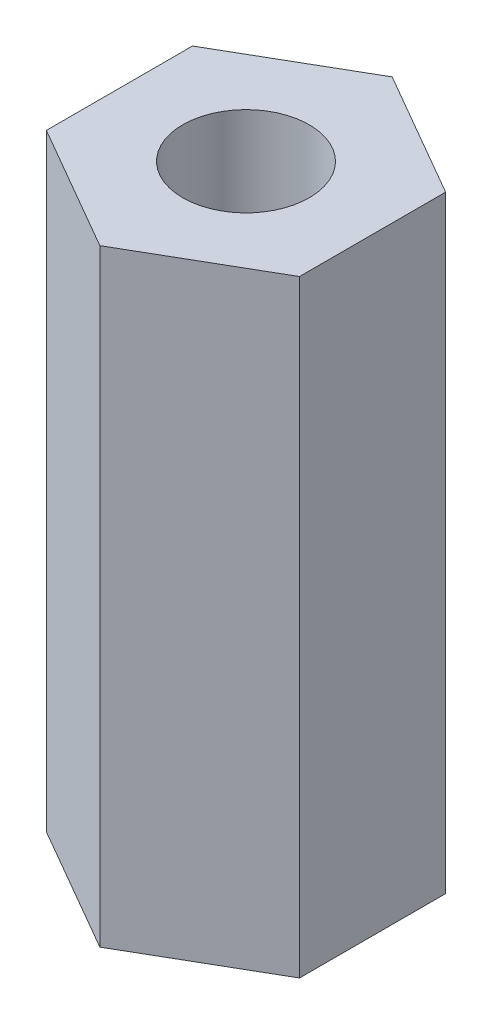
ISO-10303-21;
HEADER;
FILE_DESCRIPTION(('STEP AP214'),'2;1');
FILE_NAME('part.step','',(''),(''),'','','');
FILE_SCHEMA(('AUTOMOTIVE_DESIGN { 1 0 10303 214 1 1 1 1 }'));
ENDSEC;
DATA;
#1=APPLICATION_CONTEXT('core data for automotive mechanical design processes');
#2=APPLICATION_PROTOCOL_DEFINITION('international standard','automotive_design',2000,#1);
#3=PRODUCT_CONTEXT('',#1,'mechanical');
#4=PRODUCT('Part','Part','',(#3));
#5=PRODUCT_RELATED_PRODUCT_CATEGORY('part','',(#4));
#6=PRODUCT_DEFINITION_FORMATION('','',#4);
#7=PRODUCT_DEFINITION_CONTEXT('part definition',#1,'design');
#8=PRODUCT_DEFINITION('design','',#6,#7);
#9=PRODUCT_DEFINITION_SHAPE('','',#8);
#10=(LENGTH_UNIT() NAMED_UNIT(*) SI_UNIT(.MILLI.,.METRE.));
#11=(NAMED_UNIT(*) PLANE_ANGLE_UNIT() SI_UNIT($,.RADIAN.));
#12=(NAMED_UNIT(*) SI_UNIT($,.STERADIAN.) SOLID_ANGLE_UNIT());
#13=UNCERTAINTY_MEASURE_WITH_UNIT(LENGTH_MEASURE(1.E-05),#10,'distance_accuracy_value','');
#14=(GEOMETRIC_REPRESENTATION_CONTEXT(3) GLOBAL_UNCERTAINTY_ASSIGNED_CONTEXT((#13)) GLOBAL_UNIT_ASSIGNED_CONTEXT((#10,
#11,#12)) REPRESENTATION_CONTEXT('',''));
#15=CARTESIAN_POINT('',(0.,0.,0.));
#16=DIRECTION('',(0.,0.,1.));
#17=DIRECTION('',(1.,0.,0.));
#18=AXIS2_PLACEMENT_3D('',#15,#16,#17);
#19=CARTESIAN_POINT('',(-6.35,30.48,3.66617420935412));
#20=DIRECTION('',(0.5,0.,-0.866025403784439));
#21=DIRECTION('',(-0.866025403784439,0.,-0.5));
#22=AXIS2_PLACEMENT_3D('',#19,#20,#21);
#23=PLANE('',#22);
#24=DIRECTION('',(0.866025403784439,0.,0.5));
#25=VECTOR('',#24,1.);
#26=CARTESIAN_POINT('',(-6.35,0.,3.66617420935412));
#27=LINE('',#26,#25);
#28=CARTESIAN_POINT('',(-6.35,0.,3.66617420935412));
#29=VERTEX_POINT('',#28);
#30=CARTESIAN_POINT('',(0.,0.,7.33234841870824));
#31=VERTEX_POINT('',#30);
#32=EDGE_CURVE('E132',#29,#31,#27,.T.);
#33=ORIENTED_EDGE('',*,*,#32,.T.);
#34=DIRECTION('',(0.,-1.,0.));
#35=VECTOR('',#34,1.);
#36=CARTESIAN_POINT('',(0.,30.48,7.33234841870824));
#37=LINE('',#36,#35);
#38=CARTESIAN_POINT('',(0.,30.48,7.33234841870824));
#39=VERTEX_POINT('',#38);
#40=EDGE_CURVE('E11',#39,#31,#37,.T.);
#41=ORIENTED_EDGE('',*,*,#40,.F.);
#42=DIRECTION('',(0.866025403784439,0.,0.5));
#43=VECTOR('',#42,1.);
#44=CARTESIAN_POINT('',(-6.35,30.48,3.66617420935412));
#45=LINE('',#44,#43);
#46=CARTESIAN_POINT('',(-6.35,30.48,3.66617420935412));
#47=VERTEX_POINT('',#46);
#48=EDGE_CURVE('E149',#47,#39,#45,.T.);
#49=ORIENTED_EDGE('',*,*,#48,.F.);
#50=DIRECTION('',(0.,-1.,0.));
#51=VECTOR('',#50,1.);
#52=CARTESIAN_POINT('',(-6.35,30.48,3.66617420935412));
#53=LINE('',#52,#51);
#54=EDGE_CURVE('E128',#47,#29,#53,.T.);
#55=ORIENTED_EDGE('',*,*,#54,.T.);
#56=EDGE_LOOP('',(#33,#41,#49,#55));
#57=FACE_BOUND('',#56,.T.);
#58=ADVANCED_FACE('F43',(#57),#23,.F.);
#59=CARTESIAN_POINT('',(0.,30.48,7.33234841870824));
#60=DIRECTION('',(-0.5,0.,-0.866025403784439));
#61=DIRECTION('',(-0.866025403784439,0.,0.5));
#62=AXIS2_PLACEMENT_3D('',#59,#60,#61);
#63=PLANE('',#62);
#64=DIRECTION('',(0.866025403784439,0.,-0.5));
#65=VECTOR('',#64,1.);
#66=CARTESIAN_POINT('',(0.,0.,7.33234841870824));
#67=LINE('',#66,#65);
#68=CARTESIAN_POINT('',(6.35,0.,3.66617420935412));
#69=VERTEX_POINT('',#68);
#70=EDGE_CURVE('E136',#31,#69,#67,.T.);
#71=ORIENTED_EDGE('',*,*,#70,.T.);
#72=DIRECTION('',(0.,-1.,0.));
#73=VECTOR('',#72,1.);
#74=CARTESIAN_POINT('',(6.35,30.48,3.66617420935412));
#75=LINE('',#74,#73);
#76=CARTESIAN_POINT('',(6.35,30.48,3.66617420935412));
#77=VERTEX_POINT('',#76);
#78=EDGE_CURVE('E52',#77,#69,#75,.T.);
#79=ORIENTED_EDGE('',*,*,#78,.F.);
#80=DIRECTION('',(0.866025403784439,0.,-0.5));
#81=VECTOR('',#80,1.);
#82=CARTESIAN_POINT('',(0.,30.48,7.33234841870824));
#83=LINE('',#82,#81);
#84=EDGE_CURVE('E97',#39,#77,#83,.T.);
#85=ORIENTED_EDGE('',*,*,#84,.F.);
#86=ORIENTED_EDGE('',*,*,#40,.T.);
#87=EDGE_LOOP('',(#71,#79,#85,#86));
#88=FACE_BOUND('',#87,.T.);
#89=ADVANCED_FACE('F178',(#88),#63,.F.);
#90=CARTESIAN_POINT('',(6.35,30.48,3.66617420935412));
#91=DIRECTION('',(-1.,0.,0.));
#92=DIRECTION('',(0.,0.,1.));
#93=AXIS2_PLACEMENT_3D('',#90,#91,#92);
#94=PLANE('',#93);
#95=DIRECTION('',(0.,0.,-1.));
#96=VECTOR('',#95,1.);
#97=CARTESIAN_POINT('',(6.35,0.,3.66617420935412));
#98=LINE('',#97,#96);
#99=CARTESIAN_POINT('',(6.35,0.,-3.66617420935413));
#100=VERTEX_POINT('',#99);
#101=EDGE_CURVE('E140',#69,#100,#98,.T.);
#102=ORIENTED_EDGE('',*,*,#101,.T.);
#103=DIRECTION('',(0.,-1.,0.));
#104=VECTOR('',#103,1.);
#105=CARTESIAN_POINT('',(6.35,30.48,-3.66617420935413));
#106=LINE('',#105,#104);
#107=CARTESIAN_POINT('',(6.35,30.48,-3.66617420935413));
#108=VERTEX_POINT('',#107);
#109=EDGE_CURVE('E121',#108,#100,#106,.T.);
#110=ORIENTED_EDGE('',*,*,#109,.F.);
#111=DIRECTION('',(0.,0.,-1.));
#112=VECTOR('',#111,1.);
#113=CARTESIAN_POINT('',(6.35,30.48,3.66617420935412));
#114=LINE('',#113,#112);
#115=EDGE_CURVE('E110',#77,#108,#114,.T.);
#116=ORIENTED_EDGE('',*,*,#115,.F.);
#117=ORIENTED_EDGE('',*,*,#78,.T.);
#118=EDGE_LOOP('',(#102,#110,#116,#117));
#119=FACE_BOUND('',#118,.T.);
#120=ADVANCED_FACE('F159',(#119),#94,.F.);
#121=CARTESIAN_POINT('',(6.35,30.48,-3.66617420935413));
#122=DIRECTION('',(-0.5,0.,0.866025403784439));
#123=DIRECTION('',(0.866025403784439,0.,0.5));
#124=AXIS2_PLACEMENT_3D('',#121,#122,#123);
#125=PLANE('',#124);
#126=DIRECTION('',(-0.866025403784439,0.,-0.5));
#127=VECTOR('',#126,1.);
#128=CARTESIAN_POINT('',(6.35,0.,-3.66617420935413));
#129=LINE('',#128,#127);
#130=CARTESIAN_POINT('',(0.,0.,-7.33234841870825));
#131=VERTEX_POINT('',#130);
#132=EDGE_CURVE('E119',#100,#131,#129,.T.);
#133=ORIENTED_EDGE('',*,*,#132,.T.);
#134=DIRECTION('',(0.,-1.,0.));
#135=VECTOR('',#134,1.);
#136=CARTESIAN_POINT('',(0.,30.48,-7.33234841870825));
#137=LINE('',#136,#135);
#138=CARTESIAN_POINT('',(0.,30.48,-7.33234841870825));
#139=VERTEX_POINT('',#138);
#140=EDGE_CURVE('E116',#139,#131,#137,.T.);
#141=ORIENTED_EDGE('',*,*,#140,.F.);
#142=DIRECTION('',(-0.866025403784439,0.,-0.5));
#143=VECTOR('',#142,1.);
#144=CARTESIAN_POINT('',(6.35,30.48,-3.66617420935413));
#145=LINE('',#144,#143);
#146=EDGE_CURVE('E104',#108,#139,#145,.T.);
#147=ORIENTED_EDGE('',*,*,#146,.F.);
#148=ORIENTED_EDGE('',*,*,#109,.T.);
#149=EDGE_LOOP('',(#133,#141,#147,#148));
#150=FACE_BOUND('',#149,.T.);
#151=ADVANCED_FACE('F117',(#150),#125,.F.);
#152=CARTESIAN_POINT('',(0.,30.48,-7.33234841870825));
#153=DIRECTION('',(0.5,0.,0.866025403784439));
#154=DIRECTION('',(0.866025403784439,0.,-0.5));
#155=AXIS2_PLACEMENT_3D('',#152,#153,#154);
#156=PLANE('',#155);
#157=DIRECTION('',(-0.866025403784439,0.,0.5));
#158=VECTOR('',#157,1.);
#159=CARTESIAN_POINT('',(0.,0.,-7.33234841870825));
#160=LINE('',#159,#158);
#161=CARTESIAN_POINT('',(-6.35,0.,-3.66617420935413));
#162=VERTEX_POINT('',#161);
#163=EDGE_CURVE('E83',#131,#162,#160,.T.);
#164=ORIENTED_EDGE('',*,*,#163,.T.);
#165=DIRECTION('',(0.,-1.,0.));
#166=VECTOR('',#165,1.);
#167=CARTESIAN_POINT('',(-6.35,30.48,-3.66617420935413));
#168=LINE('',#167,#166);
#169=CARTESIAN_POINT('',(-6.35,30.48,-3.66617420935413));
#170=VERTEX_POINT('',#169);
#171=EDGE_CURVE('E122',#170,#162,#168,.T.);
#172=ORIENTED_EDGE('',*,*,#171,.F.);
#173=DIRECTION('',(-0.866025403784439,0.,0.5));
#174=VECTOR('',#173,1.);
#175=CARTESIAN_POINT('',(0.,30.48,-7.33234841870825));
#176=LINE('',#175,#174);
#177=EDGE_CURVE('E108',#139,#170,#176,.T.);
#178=ORIENTED_EDGE('',*,*,#177,.F.);
#179=ORIENTED_EDGE('',*,*,#140,.T.);
#180=EDGE_LOOP('',(#164,#172,#178,#179));
#181=FACE_BOUND('',#180,.T.);
#182=ADVANCED_FACE('F124',(#181),#156,.F.);
#183=CARTESIAN_POINT('',(-6.35,30.48,-3.66617420935413));
#184=DIRECTION('',(1.,0.,0.));
#185=DIRECTION('',(0.,0.,-1.));
#186=AXIS2_PLACEMENT_3D('',#183,#184,#185);
#187=PLANE('',#186);
#188=DIRECTION('',(0.,0.,1.));
#189=VECTOR('',#188,1.);
#190=CARTESIAN_POINT('',(-6.35,0.,-3.66617420935413));
#191=LINE('',#190,#189);
#192=EDGE_CURVE('E89',#162,#29,#191,.T.);
#193=ORIENTED_EDGE('',*,*,#192,.T.);
#194=ORIENTED_EDGE('',*,*,#54,.F.);
#195=DIRECTION('',(0.,0.,1.));
#196=VECTOR('',#195,1.);
#197=CARTESIAN_POINT('',(-6.35,30.48,-3.66617420935413));
#198=LINE('',#197,#196);
#199=EDGE_CURVE('E60',#170,#47,#198,.T.);
#200=ORIENTED_EDGE('',*,*,#199,.F.);
#201=ORIENTED_EDGE('',*,*,#171,.T.);
#202=EDGE_LOOP('',(#193,#194,#200,#201));
#203=FACE_BOUND('',#202,.T.);
#204=ADVANCED_FACE('F166',(#203),#187,.F.);
#205=CARTESIAN_POINT('',(0.,30.48,0.));
#206=DIRECTION('',(0.,1.,0.));
#207=DIRECTION('',(0.,0.,1.));
#208=AXIS2_PLACEMENT_3D('',#205,#206,#207);
#209=PLANE('',#208);
#210=CARTESIAN_POINT('',(0.,30.48,0.));
#211=DIRECTION('',(0.,1.,0.));
#212=DIRECTION('',(0.,0.,1.));
#213=AXIS2_PLACEMENT_3D('',#210,#211,#212);
#214=CIRCLE('',#213,3.175);
#215=CARTESIAN_POINT('',(0.,30.48,3.175));
#216=VERTEX_POINT('',#215);
#217=EDGE_CURVE('E137',#216,#216,#214,.T.);
#218=ORIENTED_EDGE('',*,*,#217,.F.);
#219=EDGE_LOOP('',(#218));
#220=FACE_BOUND('',#219,.T.);
#221=ORIENTED_EDGE('',*,*,#48,.T.);
#222=ORIENTED_EDGE('',*,*,#84,.T.);
#223=ORIENTED_EDGE('',*,*,#115,.T.);
#224=ORIENTED_EDGE('',*,*,#146,.T.);
#225=ORIENTED_EDGE('',*,*,#177,.T.);
#226=ORIENTED_EDGE('',*,*,#199,.T.);
#227=EDGE_LOOP('',(#221,#222,#223,#224,#225,#226));
#228=FACE_BOUND('',#227,.T.);
#229=ADVANCED_FACE('F106',(#220,#228),#209,.T.);
#230=CARTESIAN_POINT('',(0.,0.,0.));
#231=DIRECTION('',(0.,1.,0.));
#232=DIRECTION('',(0.,0.,1.));
#233=AXIS2_PLACEMENT_3D('',#230,#231,#232);
#234=PLANE('',#233);
#235=CARTESIAN_POINT('',(0.,0.,0.));
#236=DIRECTION('',(0.,1.,0.));
#237=DIRECTION('',(0.,0.,1.));
#238=AXIS2_PLACEMENT_3D('',#235,#236,#237);
#239=CIRCLE('',#238,3.175);
#240=CARTESIAN_POINT('',(0.,0.,3.175));
#241=VERTEX_POINT('',#240);
#242=EDGE_CURVE('E265',#241,#241,#239,.T.);
#243=ORIENTED_EDGE('',*,*,#242,.T.);
#244=EDGE_LOOP('',(#243));
#245=FACE_BOUND('',#244,.T.);
#246=ORIENTED_EDGE('',*,*,#32,.F.);
#247=ORIENTED_EDGE('',*,*,#192,.F.);
#248=ORIENTED_EDGE('',*,*,#163,.F.);
#249=ORIENTED_EDGE('',*,*,#132,.F.);
#250=ORIENTED_EDGE('',*,*,#101,.F.);
#251=ORIENTED_EDGE('',*,*,#70,.F.);
#252=EDGE_LOOP('',(#246,#247,#248,#249,#250,#251));
#253=FACE_BOUND('',#252,.T.);
#254=ADVANCED_FACE('F162',(#245,#253),#234,.F.);
#255=CARTESIAN_POINT('',(0.,0.,0.));
#256=DIRECTION('',(0.,1.,0.));
#257=DIRECTION('',(0.,0.,1.));
#258=AXIS2_PLACEMENT_3D('',#255,#256,#257);
#259=CYLINDRICAL_SURFACE('',#258,3.175);
#260=CARTESIAN_POINT('',(0.,30.48,3.175));
#261=CARTESIAN_POINT('',(0.,30.1625,3.175));
#262=CARTESIAN_POINT('',(0.,29.845,3.175));
#263=CARTESIAN_POINT('',(0.,29.21,3.175));
#264=CARTESIAN_POINT('',(0.,28.8925,3.175));
#265=CARTESIAN_POINT('',(0.,28.2575,3.175));
#266=CARTESIAN_POINT('',(0.,27.94,3.175));
#267=CARTESIAN_POINT('',(0.,27.305,3.175));
#268=CARTESIAN_POINT('',(0.,26.9875,3.175));
#269=CARTESIAN_POINT('',(0.,26.3525,3.175));
#270=CARTESIAN_POINT('',(0.,26.035,3.175));
#271=CARTESIAN_POINT('',(0.,25.4,3.175));
#272=CARTESIAN_POINT('',(0.,25.0825,3.175));
#273=CARTESIAN_POINT('',(0.,24.4475,3.175));
#274=CARTESIAN_POINT('',(0.,24.13,3.175));
#275=CARTESIAN_POINT('',(0.,23.495,3.175));
#276=CARTESIAN_POINT('',(0.,23.1775,3.175));
#277=CARTESIAN_POINT('',(0.,22.5425,3.175));
#278=CARTESIAN_POINT('',(0.,22.225,3.175));
#279=CARTESIAN_POINT('',(0.,21.59,3.175));
#280=CARTESIAN_POINT('',(0.,21.2725,3.175));
#281=CARTESIAN_POINT('',(0.,20.6375,3.175));
#282=CARTESIAN_POINT('',(0.,20.32,3.175));
#283=CARTESIAN_POINT('',(0.,19.685,3.175));
#284=CARTESIAN_POINT('',(0.,19.3675,3.175));
#285=CARTESIAN_POINT('',(0.,18.7325,3.175));
#286=CARTESIAN_POINT('',(0.,18.415,3.175));
#287=CARTESIAN_POINT('',(0.,17.78,3.175));
#288=CARTESIAN_POINT('',(0.,17.4625,3.175));
#289=CARTESIAN_POINT('',(0.,16.8275,3.175));
#290=CARTESIAN_POINT('',(0.,16.51,3.175));
#291=CARTESIAN_POINT('',(0.,15.875,3.175));
#292=CARTESIAN_POINT('',(0.,15.5575,3.175));
#293=CARTESIAN_POINT('',(0.,14.9225,3.175));
#294=CARTESIAN_POINT('',(0.,14.605,3.175));
#295=CARTESIAN_POINT('',(0.,13.97,3.175));
#296=CARTESIAN_POINT('',(0.,13.6525,3.175));
#297=CARTESIAN_POINT('',(0.,13.0175,3.175));
#298=CARTESIAN_POINT('',(0.,12.7,3.175));
#299=CARTESIAN_POINT('',(0.,12.065,3.175));
#300=CARTESIAN_POINT('',(0.,11.7475,3.175));
#301=CARTESIAN_POINT('',(0.,11.1125,3.175));
#302=CARTESIAN_POINT('',(0.,10.795,3.175));
#303=CARTESIAN_POINT('',(0.,10.16,3.175));
#304=CARTESIAN_POINT('',(0.,9.8425,3.175));
#305=CARTESIAN_POINT('',(0.,9.2075,3.175));
#306=CARTESIAN_POINT('',(0.,8.89,3.175));
#307=CARTESIAN_POINT('',(0.,8.255,3.175));
#308=CARTESIAN_POINT('',(0.,7.9375,3.175));
#309=CARTESIAN_POINT('',(0.,7.3025,3.175));
#310=CARTESIAN_POINT('',(0.,6.985,3.175));
#311=CARTESIAN_POINT('',(0.,6.35,3.175));
#312=CARTESIAN_POINT('',(0.,6.0325,3.175));
#313=CARTESIAN_POINT('',(0.,5.3975,3.175));
#314=CARTESIAN_POINT('',(0.,5.08,3.175));
#315=CARTESIAN_POINT('',(0.,4.445,3.175));
#316=CARTESIAN_POINT('',(0.,4.1275,3.175));
#317=CARTESIAN_POINT('',(0.,3.4925,3.175));
#318=CARTESIAN_POINT('',(0.,3.175,3.175));
#319=CARTESIAN_POINT('',(0.,2.54,3.175));
#320=CARTESIAN_POINT('',(0.,2.2225,3.175));
#321=CARTESIAN_POINT('',(0.,1.5875,3.175));
#322=CARTESIAN_POINT('',(0.,1.27,3.175));
#323=CARTESIAN_POINT('',(0.,0.634999999999999,3.175));
#324=CARTESIAN_POINT('',(0.,0.317499999999999,3.175));
#325=CARTESIAN_POINT('',(0.,0.,3.175));
#326=B_SPLINE_CURVE_WITH_KNOTS('',3,(#260,#261,#262,#263,#264,#265,#266,#267,#268,#269,#270,
#271,#272,#273,#274,#275,#276,#277,#278,#279,#280,#281,#282,#283,#284,#285,#286,#287,#288,#289,
#290,#291,#292,#293,#294,#295,#296,#297,#298,#299,#300,#301,#302,#303,#304,#305,#306,#307,#308,
#309,#310,#311,#312,#313,#314,#315,#316,#317,#318,#319,#320,#321,#322,#323,#324,#325),
.UNSPECIFIED.,.F.,.F.,(4,2,2,2,2,2,2,2,2,2,2,2,2,2,2,2,2,2,2,2,2,2,2,2,2,2,2,2,2,2,2,2,4),(0.,
0.952499999999998,1.905,2.8575,3.81,4.7625,5.715,6.6675,7.62,8.5725,9.525,10.4775,11.43,12.3825,
13.335,14.2875,15.24,16.1925,17.145,18.0975,19.05,20.0025,20.955,21.9075,22.86,23.8125,24.765,
25.7175,26.67,27.6225,28.575,29.5275,30.48),.UNSPECIFIED.);
#327=EDGE_CURVE('BSEAM218',#216,#241,#326,.T.);
#328=ORIENTED_EDGE('',*,*,#217,.T.);
#329=ORIENTED_EDGE('',*,*,#242,.F.);
#330=ORIENTED_EDGE('',*,*,#327,.T.);
#331=ORIENTED_EDGE('',*,*,#327,.F.);
#332=EDGE_LOOP('',(#328,#330,#329,#331));
#333=FACE_BOUND('',#332,.T.);
#334=ADVANCED_FACE('F218',(#333),#259,.F.);
#335=CLOSED_SHELL('',(#58,#89,#120,#151,#182,#204,#229,#254,#334));
#336=MANIFOLD_SOLID_BREP('B2',#335);
#337=ADVANCED_BREP_SHAPE_REPRESENTATION('',(#18,#336),#14);
#338=SHAPE_DEFINITION_REPRESENTATION(#9,#337);
ENDSEC;
END-ISO-10303-21;
